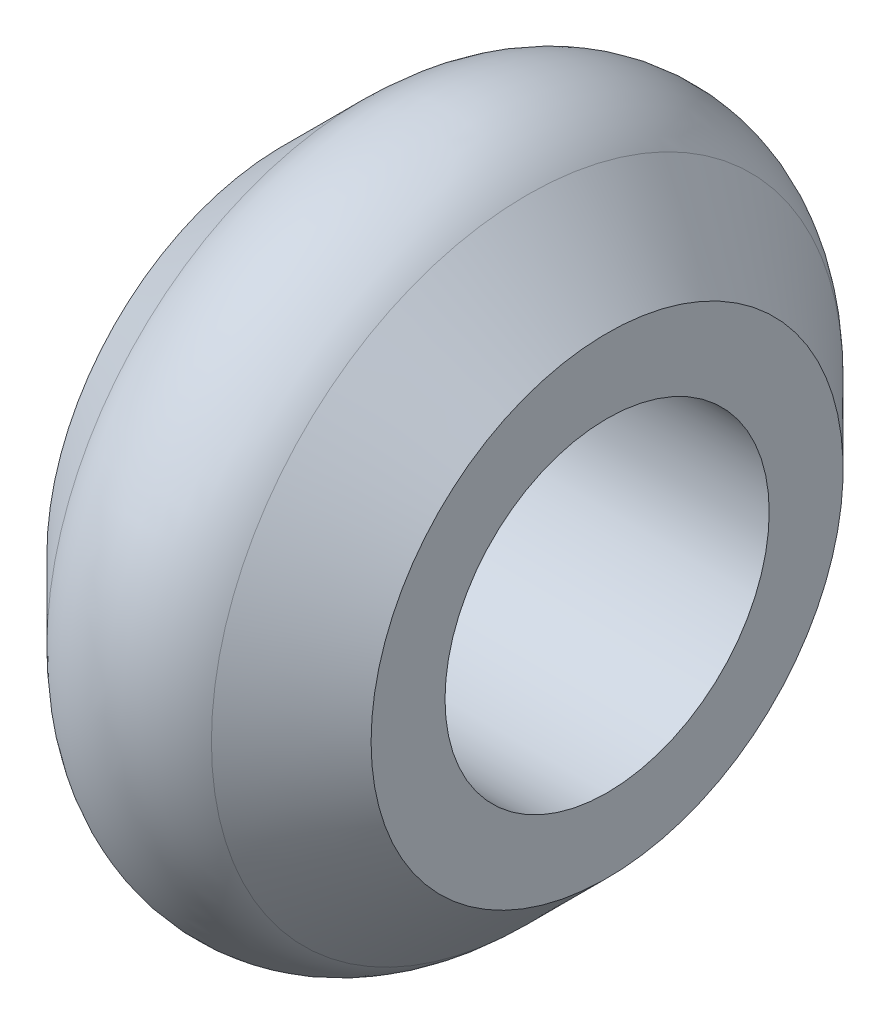
ISO-10303-21;
HEADER;
FILE_DESCRIPTION(('STEP AP214'),'2;1');
FILE_NAME('part.step','',(''),(''),'','','');
FILE_SCHEMA(('AUTOMOTIVE_DESIGN { 1 0 10303 214 1 1 1 1 }'));
ENDSEC;
DATA;
#1=APPLICATION_CONTEXT('core data for automotive mechanical design processes');
#2=APPLICATION_PROTOCOL_DEFINITION('international standard','automotive_design',2000,#1);
#3=PRODUCT_CONTEXT('',#1,'mechanical');
#4=PRODUCT('Part','Part','',(#3));
#5=PRODUCT_RELATED_PRODUCT_CATEGORY('part','',(#4));
#6=PRODUCT_DEFINITION_FORMATION('','',#4);
#7=PRODUCT_DEFINITION_CONTEXT('part definition',#1,'design');
#8=PRODUCT_DEFINITION('design','',#6,#7);
#9=PRODUCT_DEFINITION_SHAPE('','',#8);
#10=(LENGTH_UNIT() NAMED_UNIT(*) SI_UNIT(.MILLI.,.METRE.));
#11=(NAMED_UNIT(*) PLANE_ANGLE_UNIT() SI_UNIT($,.RADIAN.));
#12=(NAMED_UNIT(*) SI_UNIT($,.STERADIAN.) SOLID_ANGLE_UNIT());
#13=UNCERTAINTY_MEASURE_WITH_UNIT(LENGTH_MEASURE(1.E-05),#10,'distance_accuracy_value','');
#14=(GEOMETRIC_REPRESENTATION_CONTEXT(3) GLOBAL_UNCERTAINTY_ASSIGNED_CONTEXT((#13)) GLOBAL_UNIT_ASSIGNED_CONTEXT((#10,
#11,#12)) REPRESENTATION_CONTEXT('',''));
#15=CARTESIAN_POINT('',(0.,0.,0.));
#16=DIRECTION('',(0.,0.,1.));
#17=DIRECTION('',(1.,0.,0.));
#18=AXIS2_PLACEMENT_3D('',#15,#16,#17);
#19=CARTESIAN_POINT('',(-5.55625,5.55625,0.));
#20=DIRECTION('',(1.,0.,0.));
#21=DIRECTION('',(0.,0.,-1.));
#22=AXIS2_PLACEMENT_3D('',#19,#20,#21);
#23=PLANE('',#22);
#24=CARTESIAN_POINT('',(-5.55625,0.,0.));
#25=DIRECTION('',(-1.,0.,0.));
#26=DIRECTION('',(0.,0.,1.));
#27=AXIS2_PLACEMENT_3D('',#24,#25,#26);
#28=CIRCLE('',#27,5.55625);
#29=CARTESIAN_POINT('',(-5.55625,0.,5.55625));
#30=VERTEX_POINT('',#29);
#31=EDGE_CURVE('E54',#30,#30,#28,.T.);
#32=ORIENTED_EDGE('',*,*,#31,.F.);
#33=EDGE_LOOP('',(#32));
#34=FACE_BOUND('',#33,.T.);
#35=CARTESIAN_POINT('',(-5.55625,0.,0.));
#36=DIRECTION('',(-1.,0.,0.));
#37=DIRECTION('',(0.,0.,1.));
#38=AXIS2_PLACEMENT_3D('',#35,#36,#37);
#39=CIRCLE('',#38,8.0899);
#40=CARTESIAN_POINT('',(-5.55625,0.,8.0899));
#41=VERTEX_POINT('',#40);
#42=EDGE_CURVE('E42',#41,#41,#39,.T.);
#43=ORIENTED_EDGE('',*,*,#42,.T.);
#44=EDGE_LOOP('',(#43));
#45=FACE_BOUND('',#44,.T.);
#46=ADVANCED_FACE('F31',(#34,#45),#23,.F.);
#47=CARTESIAN_POINT('',(0.,0.,0.));
#48=DIRECTION('',(1.,0.,0.));
#49=DIRECTION('',(0.,0.,-1.));
#50=AXIS2_PLACEMENT_3D('',#47,#48,#49);
#51=CONICAL_SURFACE('',#50,13.64615,0.785398163397447);
#52=CARTESIAN_POINT('',(-2.81980042201571,0.,0.));
#53=DIRECTION('',(-1.,0.,0.));
#54=DIRECTION('',(0.,0.,1.));
#55=AXIS2_PLACEMENT_3D('',#52,#53,#54);
#56=CIRCLE('',#55,10.8263495779843);
#57=CARTESIAN_POINT('',(-2.81980042201571,0.,10.8263495779843));
#58=VERTEX_POINT('',#57);
#59=EDGE_CURVE('E38',#58,#58,#56,.T.);
#60=ORIENTED_EDGE('',*,*,#59,.T.);
#61=EDGE_LOOP('',(#60));
#62=FACE_BOUND('',#61,.T.);
#63=ORIENTED_EDGE('',*,*,#42,.F.);
#64=EDGE_LOOP('',(#63));
#65=FACE_BOUND('',#64,.T.);
#66=ADVANCED_FACE('F62',(#62,#65),#51,.T.);
#67=CARTESIAN_POINT('',(5.55625,0.,0.));
#68=DIRECTION('',(-1.,0.,0.));
#69=DIRECTION('',(0.,0.,1.));
#70=AXIS2_PLACEMENT_3D('',#67,#68,#69);
#71=CONICAL_SURFACE('',#70,8.0899,0.785398163397447);
#72=CARTESIAN_POINT('',(2.81980042201571,0.,0.));
#73=DIRECTION('',(1.,0.,0.));
#74=DIRECTION('',(0.,0.,-1.));
#75=AXIS2_PLACEMENT_3D('',#72,#73,#74);
#76=CIRCLE('',#75,10.8263495779843);
#77=CARTESIAN_POINT('',(2.81980042201571,0.,-10.8263495779843));
#78=VERTEX_POINT('',#77);
#79=EDGE_CURVE('E10',#78,#78,#76,.T.);
#80=ORIENTED_EDGE('',*,*,#79,.T.);
#81=EDGE_LOOP('',(#80));
#82=FACE_BOUND('',#81,.T.);
#83=CARTESIAN_POINT('',(5.55625,0.,0.));
#84=DIRECTION('',(-1.,0.,0.));
#85=DIRECTION('',(0.,0.,1.));
#86=AXIS2_PLACEMENT_3D('',#83,#84,#85);
#87=CIRCLE('',#86,8.0899);
#88=CARTESIAN_POINT('',(5.55625,0.,8.0899));
#89=VERTEX_POINT('',#88);
#90=EDGE_CURVE('E46',#89,#89,#87,.T.);
#91=ORIENTED_EDGE('',*,*,#90,.T.);
#92=EDGE_LOOP('',(#91));
#93=FACE_BOUND('',#92,.T.);
#94=ADVANCED_FACE('F66',(#82,#93),#71,.T.);
#95=CARTESIAN_POINT('',(5.55625,5.55625,0.));
#96=DIRECTION('',(-1.,0.,0.));
#97=DIRECTION('',(0.,0.,1.));
#98=AXIS2_PLACEMENT_3D('',#95,#96,#97);
#99=PLANE('',#98);
#100=ORIENTED_EDGE('',*,*,#90,.F.);
#101=EDGE_LOOP('',(#100));
#102=FACE_BOUND('',#101,.T.);
#103=CARTESIAN_POINT('',(5.55625,0.,0.));
#104=DIRECTION('',(-1.,0.,0.));
#105=DIRECTION('',(0.,0.,1.));
#106=AXIS2_PLACEMENT_3D('',#103,#104,#105);
#107=CIRCLE('',#106,5.55625);
#108=CARTESIAN_POINT('',(5.55625,0.,5.55625));
#109=VERTEX_POINT('',#108);
#110=EDGE_CURVE('E51',#109,#109,#107,.T.);
#111=ORIENTED_EDGE('',*,*,#110,.T.);
#112=EDGE_LOOP('',(#111));
#113=FACE_BOUND('',#112,.T.);
#114=ADVANCED_FACE('F71',(#102,#113),#99,.F.);
#115=CARTESIAN_POINT('',(-5.55625,0.,0.));
#116=DIRECTION('',(-1.,0.,0.));
#117=DIRECTION('',(0.,0.,1.));
#118=AXIS2_PLACEMENT_3D('',#115,#116,#117);
#119=CYLINDRICAL_SURFACE('',#118,5.55625);
#120=ORIENTED_EDGE('',*,*,#110,.F.);
#121=EDGE_LOOP('',(#120));
#122=FACE_BOUND('',#121,.T.);
#123=ORIENTED_EDGE('',*,*,#31,.T.);
#124=EDGE_LOOP('',(#123));
#125=FACE_BOUND('',#124,.T.);
#126=ADVANCED_FACE('F58',(#122,#125),#119,.F.);
#127=CARTESIAN_POINT('',(0.,0.,0.));
#128=DIRECTION('',(1.,0.,0.));
#129=DIRECTION('',(0.,0.,-1.));
#130=AXIS2_PLACEMENT_3D('',#127,#128,#129);
#131=TOROIDAL_SURFACE('',#130,8.00654915596856,3.9878);
#132=ORIENTED_EDGE('',*,*,#79,.F.);
#133=EDGE_LOOP('',(#132));
#134=FACE_BOUND('',#133,.T.);
#135=ORIENTED_EDGE('',*,*,#59,.F.);
#136=EDGE_LOOP('',(#135));
#137=FACE_BOUND('',#136,.T.);
#138=ADVANCED_FACE('F33',(#134,#137),#131,.T.);
#139=CLOSED_SHELL('',(#46,#66,#94,#114,#126,#138));
#140=MANIFOLD_SOLID_BREP('B2',#139);
#141=ADVANCED_BREP_SHAPE_REPRESENTATION('',(#18,#140),#14);
#142=SHAPE_DEFINITION_REPRESENTATION(#9,#141);
ENDSEC;
END-ISO-10303-21;
